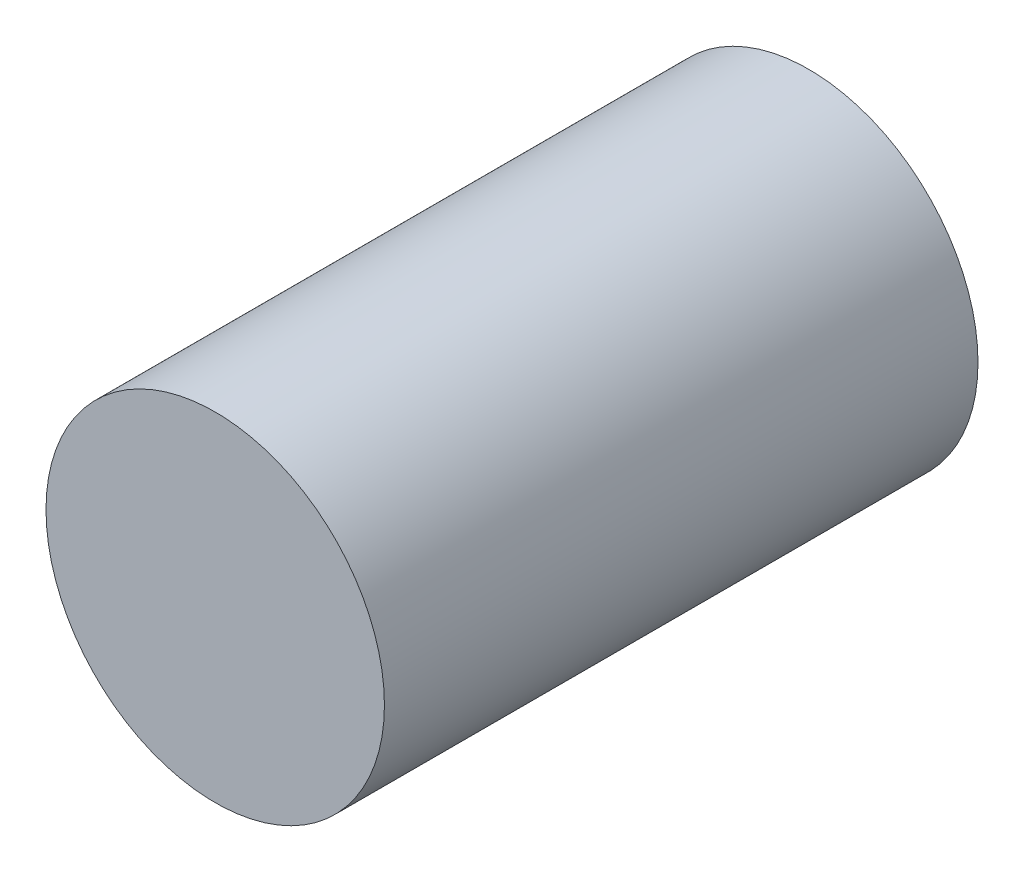
ISO-10303-21;
HEADER;
FILE_DESCRIPTION(('STEP AP214'),'2;1');
FILE_NAME('part.step','',(''),(''),'','','');
FILE_SCHEMA(('AUTOMOTIVE_DESIGN { 1 0 10303 214 1 1 1 1 }'));
ENDSEC;
DATA;
#1=APPLICATION_CONTEXT('core data for automotive mechanical design processes');
#2=APPLICATION_PROTOCOL_DEFINITION('international standard','automotive_design',2000,#1);
#3=PRODUCT_CONTEXT('',#1,'mechanical');
#4=PRODUCT('Part','Part','',(#3));
#5=PRODUCT_RELATED_PRODUCT_CATEGORY('part','',(#4));
#6=PRODUCT_DEFINITION_FORMATION('','',#4);
#7=PRODUCT_DEFINITION_CONTEXT('part definition',#1,'design');
#8=PRODUCT_DEFINITION('design','',#6,#7);
#9=PRODUCT_DEFINITION_SHAPE('','',#8);
#10=(LENGTH_UNIT() NAMED_UNIT(*) SI_UNIT(.MILLI.,.METRE.));
#11=(NAMED_UNIT(*) PLANE_ANGLE_UNIT() SI_UNIT($,.RADIAN.));
#12=(NAMED_UNIT(*) SI_UNIT($,.STERADIAN.) SOLID_ANGLE_UNIT());
#13=UNCERTAINTY_MEASURE_WITH_UNIT(LENGTH_MEASURE(1.E-05),#10,'distance_accuracy_value','');
#14=(GEOMETRIC_REPRESENTATION_CONTEXT(3) GLOBAL_UNCERTAINTY_ASSIGNED_CONTEXT((#13)) GLOBAL_UNIT_ASSIGNED_CONTEXT((#10,
#11,#12)) REPRESENTATION_CONTEXT('',''));
#15=CARTESIAN_POINT('',(0.,0.,0.));
#16=DIRECTION('',(0.,0.,1.));
#17=DIRECTION('',(1.,0.,0.));
#18=AXIS2_PLACEMENT_3D('',#15,#16,#17);
#19=CARTESIAN_POINT('',(0.,0.,11.4));
#20=DIRECTION('',(0.,0.,-1.));
#21=DIRECTION('',(-1.,0.,0.));
#22=AXIS2_PLACEMENT_3D('',#19,#20,#21);
#23=CYLINDRICAL_SURFACE('',#22,3.25);
#24=CARTESIAN_POINT('',(0.,0.,11.4));
#25=DIRECTION('',(0.,0.,1.));
#26=DIRECTION('',(1.,0.,0.));
#27=AXIS2_PLACEMENT_3D('',#24,#25,#26);
#28=CIRCLE('',#27,3.25);
#29=CARTESIAN_POINT('',(3.25,0.,11.4));
#30=VERTEX_POINT('',#29);
#31=EDGE_CURVE('E10',#30,#30,#28,.T.);
#32=ORIENTED_EDGE('',*,*,#31,.F.);
#33=EDGE_LOOP('',(#32));
#34=FACE_BOUND('',#33,.T.);
#35=CARTESIAN_POINT('',(0.,0.,0.));
#36=DIRECTION('',(0.,0.,1.));
#37=DIRECTION('',(1.,0.,0.));
#38=AXIS2_PLACEMENT_3D('',#35,#36,#37);
#39=CIRCLE('',#38,3.25);
#40=CARTESIAN_POINT('',(3.25,0.,0.));
#41=VERTEX_POINT('',#40);
#42=EDGE_CURVE('E38',#41,#41,#39,.T.);
#43=ORIENTED_EDGE('',*,*,#42,.T.);
#44=EDGE_LOOP('',(#43));
#45=FACE_BOUND('',#44,.T.);
#46=ADVANCED_FACE('F35',(#34,#45),#23,.T.);
#47=CARTESIAN_POINT('',(0.,0.,11.4));
#48=DIRECTION('',(0.,0.,1.));
#49=DIRECTION('',(1.,0.,0.));
#50=AXIS2_PLACEMENT_3D('',#47,#48,#49);
#51=PLANE('',#50);
#52=ORIENTED_EDGE('',*,*,#31,.T.);
#53=EDGE_LOOP('',(#52));
#54=FACE_BOUND('',#53,.T.);
#55=ADVANCED_FACE('F50',(#54),#51,.T.);
#56=CARTESIAN_POINT('',(0.,0.,0.));
#57=DIRECTION('',(0.,0.,1.));
#58=DIRECTION('',(1.,0.,0.));
#59=AXIS2_PLACEMENT_3D('',#56,#57,#58);
#60=PLANE('',#59);
#61=ORIENTED_EDGE('',*,*,#42,.F.);
#62=EDGE_LOOP('',(#61));
#63=FACE_BOUND('',#62,.T.);
#64=ADVANCED_FACE('F48',(#63),#60,.F.);
#65=CLOSED_SHELL('',(#46,#55,#64));
#66=MANIFOLD_SOLID_BREP('B2',#65);
#67=ADVANCED_BREP_SHAPE_REPRESENTATION('',(#18,#66),#14);
#68=SHAPE_DEFINITION_REPRESENTATION(#9,#67);
ENDSEC;
END-ISO-10303-21;
